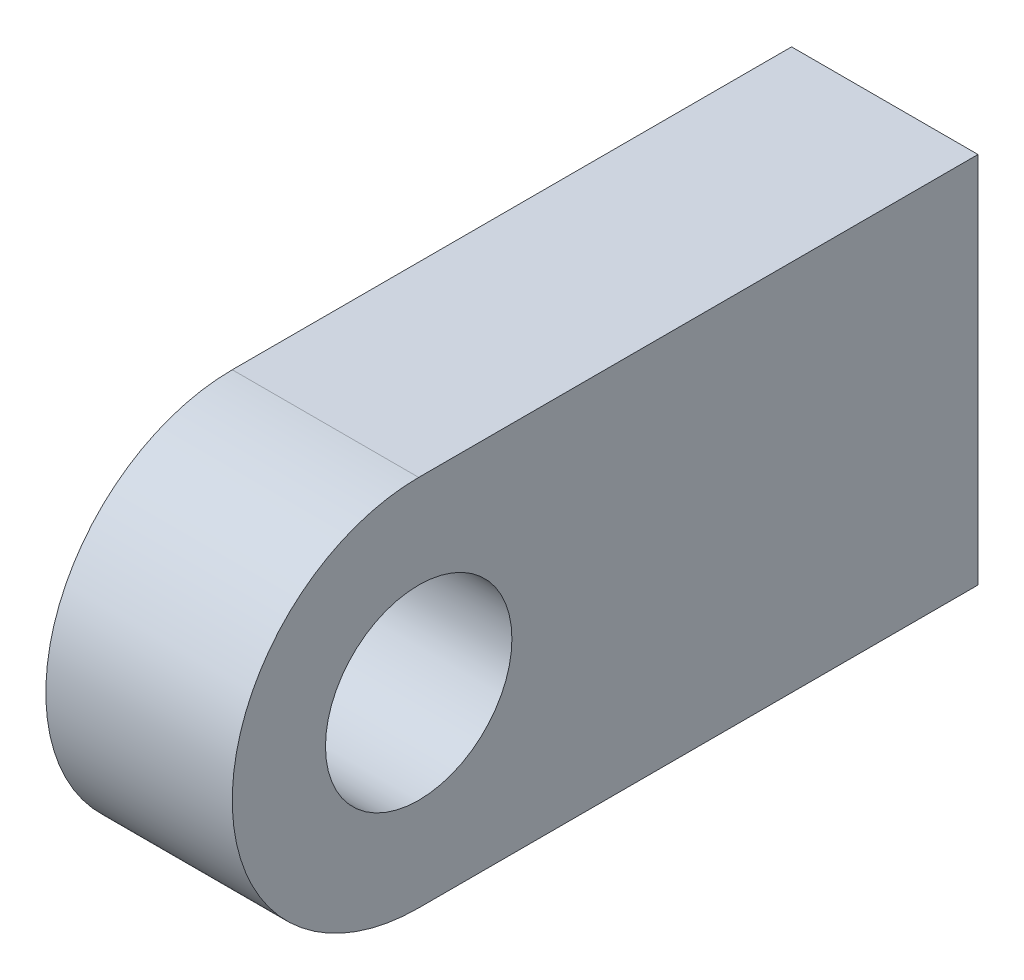
ISO-10303-21;
HEADER;
FILE_DESCRIPTION(('STEP AP214'),'2;1');
FILE_NAME('part.step','',(''),(''),'','','');
FILE_SCHEMA(('AUTOMOTIVE_DESIGN { 1 0 10303 214 1 1 1 1 }'));
ENDSEC;
DATA;
#1=APPLICATION_CONTEXT('core data for automotive mechanical design processes');
#2=APPLICATION_PROTOCOL_DEFINITION('international standard','automotive_design',2000,#1);
#3=PRODUCT_CONTEXT('',#1,'mechanical');
#4=PRODUCT('Part','Part','',(#3));
#5=PRODUCT_RELATED_PRODUCT_CATEGORY('part','',(#4));
#6=PRODUCT_DEFINITION_FORMATION('','',#4);
#7=PRODUCT_DEFINITION_CONTEXT('part definition',#1,'design');
#8=PRODUCT_DEFINITION('design','',#6,#7);
#9=PRODUCT_DEFINITION_SHAPE('','',#8);
#10=(LENGTH_UNIT() NAMED_UNIT(*) SI_UNIT(.MILLI.,.METRE.));
#11=(NAMED_UNIT(*) PLANE_ANGLE_UNIT() SI_UNIT($,.RADIAN.));
#12=(NAMED_UNIT(*) SI_UNIT($,.STERADIAN.) SOLID_ANGLE_UNIT());
#13=UNCERTAINTY_MEASURE_WITH_UNIT(LENGTH_MEASURE(1.E-05),#10,'distance_accuracy_value','');
#14=(GEOMETRIC_REPRESENTATION_CONTEXT(3) GLOBAL_UNCERTAINTY_ASSIGNED_CONTEXT((#13)) GLOBAL_UNIT_ASSIGNED_CONTEXT((#10,
#11,#12)) REPRESENTATION_CONTEXT('',''));
#15=CARTESIAN_POINT('',(0.,0.,0.));
#16=DIRECTION('',(0.,0.,1.));
#17=DIRECTION('',(1.,0.,0.));
#18=AXIS2_PLACEMENT_3D('',#15,#16,#17);
#19=CARTESIAN_POINT('',(-13.,0.,265.));
#20=DIRECTION('',(-1.,0.,0.));
#21=DIRECTION('',(0.,0.,1.));
#22=AXIS2_PLACEMENT_3D('',#19,#20,#21);
#23=PLANE('',#22);
#24=CARTESIAN_POINT('',(-13.,0.,265.));
#25=DIRECTION('',(-1.,0.,0.));
#26=DIRECTION('',(0.,0.,1.));
#27=AXIS2_PLACEMENT_3D('',#24,#25,#26);
#28=CIRCLE('',#27,9.99999999999994);
#29=CARTESIAN_POINT('',(-13.,-9.99999999999994,265.));
#30=VERTEX_POINT('',#29);
#31=CARTESIAN_POINT('',(-13.,9.99999999999994,265.));
#32=VERTEX_POINT('',#31);
#33=EDGE_CURVE('E105',#30,#32,#28,.T.);
#34=ORIENTED_EDGE('',*,*,#33,.T.);
#35=DIRECTION('',(0.,0.,-1.));
#36=VECTOR('',#35,1.);
#37=CARTESIAN_POINT('',(-13.,9.99999999999994,265.));
#38=LINE('',#37,#36);
#39=CARTESIAN_POINT('',(-13.,9.99999999999993,235.));
#40=VERTEX_POINT('',#39);
#41=EDGE_CURVE('E74',#32,#40,#38,.T.);
#42=ORIENTED_EDGE('',*,*,#41,.T.);
#43=DIRECTION('',(0.,-1.,0.));
#44=VECTOR('',#43,1.);
#45=CARTESIAN_POINT('',(-13.,9.99999999999993,235.));
#46=LINE('',#45,#44);
#47=CARTESIAN_POINT('',(-13.,-9.99999999999993,235.));
#48=VERTEX_POINT('',#47);
#49=EDGE_CURVE('E113',#40,#48,#46,.T.);
#50=ORIENTED_EDGE('',*,*,#49,.T.);
#51=DIRECTION('',(0.,0.,1.));
#52=VECTOR('',#51,1.);
#53=CARTESIAN_POINT('',(-13.,-9.99999999999993,235.));
#54=LINE('',#53,#52);
#55=EDGE_CURVE('E98',#48,#30,#54,.T.);
#56=ORIENTED_EDGE('',*,*,#55,.T.);
#57=EDGE_LOOP('',(#34,#42,#50,#56));
#58=FACE_BOUND('',#57,.T.);
#59=CARTESIAN_POINT('',(-13.,0.,265.));
#60=DIRECTION('',(-1.,0.,0.));
#61=DIRECTION('',(0.,0.,1.));
#62=AXIS2_PLACEMENT_3D('',#59,#60,#61);
#63=CIRCLE('',#62,4.99999999999999);
#64=CARTESIAN_POINT('',(-13.,0.,270.));
#65=VERTEX_POINT('',#64);
#66=EDGE_CURVE('E45',#65,#65,#63,.T.);
#67=ORIENTED_EDGE('',*,*,#66,.F.);
#68=EDGE_LOOP('',(#67));
#69=FACE_BOUND('',#68,.T.);
#70=ADVANCED_FACE('F41',(#58,#69),#23,.T.);
#71=CARTESIAN_POINT('',(-3.,0.,265.));
#72=DIRECTION('',(-1.,0.,0.));
#73=DIRECTION('',(0.,0.,1.));
#74=AXIS2_PLACEMENT_3D('',#71,#72,#73);
#75=PLANE('',#74);
#76=CARTESIAN_POINT('',(-3.,0.,265.));
#77=DIRECTION('',(-1.,0.,0.));
#78=DIRECTION('',(0.,0.,1.));
#79=AXIS2_PLACEMENT_3D('',#76,#77,#78);
#80=CIRCLE('',#79,9.99999999999994);
#81=CARTESIAN_POINT('',(-3.,-9.99999999999994,265.));
#82=VERTEX_POINT('',#81);
#83=CARTESIAN_POINT('',(-3.,9.99999999999994,265.));
#84=VERTEX_POINT('',#83);
#85=EDGE_CURVE('E104',#82,#84,#80,.T.);
#86=ORIENTED_EDGE('',*,*,#85,.F.);
#87=DIRECTION('',(0.,0.,1.));
#88=VECTOR('',#87,1.);
#89=CARTESIAN_POINT('',(-3.,-9.99999999999993,235.));
#90=LINE('',#89,#88);
#91=CARTESIAN_POINT('',(-3.,-9.99999999999993,235.));
#92=VERTEX_POINT('',#91);
#93=EDGE_CURVE('E84',#92,#82,#90,.T.);
#94=ORIENTED_EDGE('',*,*,#93,.F.);
#95=DIRECTION('',(0.,-1.,0.));
#96=VECTOR('',#95,1.);
#97=CARTESIAN_POINT('',(-3.,9.99999999999993,235.));
#98=LINE('',#97,#96);
#99=CARTESIAN_POINT('',(-3.,9.99999999999993,235.));
#100=VERTEX_POINT('',#99);
#101=EDGE_CURVE('E90',#100,#92,#98,.T.);
#102=ORIENTED_EDGE('',*,*,#101,.F.);
#103=DIRECTION('',(0.,0.,-1.));
#104=VECTOR('',#103,1.);
#105=CARTESIAN_POINT('',(-3.,9.99999999999994,265.));
#106=LINE('',#105,#104);
#107=EDGE_CURVE('E58',#84,#100,#106,.T.);
#108=ORIENTED_EDGE('',*,*,#107,.F.);
#109=EDGE_LOOP('',(#86,#94,#102,#108));
#110=FACE_BOUND('',#109,.T.);
#111=CARTESIAN_POINT('',(-3.,0.,265.));
#112=DIRECTION('',(-1.,0.,0.));
#113=DIRECTION('',(0.,0.,1.));
#114=AXIS2_PLACEMENT_3D('',#111,#112,#113);
#115=CIRCLE('',#114,4.99999999999999);
#116=CARTESIAN_POINT('',(-3.,0.,270.));
#117=VERTEX_POINT('',#116);
#118=EDGE_CURVE('E11',#117,#117,#115,.T.);
#119=ORIENTED_EDGE('',*,*,#118,.T.);
#120=EDGE_LOOP('',(#119));
#121=FACE_BOUND('',#120,.T.);
#122=ADVANCED_FACE('F101',(#110,#121),#75,.F.);
#123=CARTESIAN_POINT('',(-13.,0.,265.));
#124=DIRECTION('',(1.,0.,0.));
#125=DIRECTION('',(0.,0.,-1.));
#126=AXIS2_PLACEMENT_3D('',#123,#124,#125);
#127=CYLINDRICAL_SURFACE('',#126,9.99999999999994);
#128=ORIENTED_EDGE('',*,*,#85,.T.);
#129=DIRECTION('',(1.,0.,0.));
#130=VECTOR('',#129,1.);
#131=CARTESIAN_POINT('',(-13.,9.99999999999994,265.));
#132=LINE('',#131,#130);
#133=EDGE_CURVE('E120',#32,#84,#132,.T.);
#134=ORIENTED_EDGE('',*,*,#133,.F.);
#135=ORIENTED_EDGE('',*,*,#33,.F.);
#136=DIRECTION('',(1.,0.,0.));
#137=VECTOR('',#136,1.);
#138=CARTESIAN_POINT('',(-13.,-9.99999999999994,265.));
#139=LINE('',#138,#137);
#140=EDGE_CURVE('E99',#30,#82,#139,.T.);
#141=ORIENTED_EDGE('',*,*,#140,.T.);
#142=EDGE_LOOP('',(#128,#134,#135,#141));
#143=FACE_BOUND('',#142,.T.);
#144=ADVANCED_FACE('F119',(#143),#127,.T.);
#145=CARTESIAN_POINT('',(-13.,9.99999999999994,265.));
#146=DIRECTION('',(0.,-1.,0.));
#147=DIRECTION('',(0.,0.,-1.));
#148=AXIS2_PLACEMENT_3D('',#145,#146,#147);
#149=PLANE('',#148);
#150=ORIENTED_EDGE('',*,*,#107,.T.);
#151=DIRECTION('',(1.,0.,0.));
#152=VECTOR('',#151,1.);
#153=CARTESIAN_POINT('',(-13.,9.99999999999993,235.));
#154=LINE('',#153,#152);
#155=EDGE_CURVE('E95',#40,#100,#154,.T.);
#156=ORIENTED_EDGE('',*,*,#155,.F.);
#157=ORIENTED_EDGE('',*,*,#41,.F.);
#158=ORIENTED_EDGE('',*,*,#133,.T.);
#159=EDGE_LOOP('',(#150,#156,#157,#158));
#160=FACE_BOUND('',#159,.T.);
#161=ADVANCED_FACE('F123',(#160),#149,.F.);
#162=CARTESIAN_POINT('',(-13.,9.99999999999993,235.));
#163=DIRECTION('',(0.,0.,1.));
#164=DIRECTION('',(1.,0.,0.));
#165=AXIS2_PLACEMENT_3D('',#162,#163,#164);
#166=PLANE('',#165);
#167=ORIENTED_EDGE('',*,*,#101,.T.);
#168=DIRECTION('',(1.,0.,0.));
#169=VECTOR('',#168,1.);
#170=CARTESIAN_POINT('',(-13.,-9.99999999999993,235.));
#171=LINE('',#170,#169);
#172=EDGE_CURVE('E93',#48,#92,#171,.T.);
#173=ORIENTED_EDGE('',*,*,#172,.F.);
#174=ORIENTED_EDGE('',*,*,#49,.F.);
#175=ORIENTED_EDGE('',*,*,#155,.T.);
#176=EDGE_LOOP('',(#167,#173,#174,#175));
#177=FACE_BOUND('',#176,.T.);
#178=ADVANCED_FACE('F91',(#177),#166,.F.);
#179=CARTESIAN_POINT('',(-13.,-9.99999999999993,235.));
#180=DIRECTION('',(0.,1.,0.));
#181=DIRECTION('',(0.,0.,1.));
#182=AXIS2_PLACEMENT_3D('',#179,#180,#181);
#183=PLANE('',#182);
#184=ORIENTED_EDGE('',*,*,#93,.T.);
#185=ORIENTED_EDGE('',*,*,#140,.F.);
#186=ORIENTED_EDGE('',*,*,#55,.F.);
#187=ORIENTED_EDGE('',*,*,#172,.T.);
#188=EDGE_LOOP('',(#184,#185,#186,#187));
#189=FACE_BOUND('',#188,.T.);
#190=ADVANCED_FACE('F97',(#189),#183,.F.);
#191=CARTESIAN_POINT('',(-13.,0.,265.));
#192=DIRECTION('',(1.,0.,0.));
#193=DIRECTION('',(0.,0.,-1.));
#194=AXIS2_PLACEMENT_3D('',#191,#192,#193);
#195=CYLINDRICAL_SURFACE('',#194,4.99999999999999);
#196=ORIENTED_EDGE('',*,*,#66,.T.);
#197=EDGE_LOOP('',(#196));
#198=FACE_BOUND('',#197,.T.);
#199=ORIENTED_EDGE('',*,*,#118,.F.);
#200=EDGE_LOOP('',(#199));
#201=FACE_BOUND('',#200,.T.);
#202=ADVANCED_FACE('F43',(#198,#201),#195,.F.);
#203=CLOSED_SHELL('',(#70,#122,#144,#161,#178,#190,#202));
#204=MANIFOLD_SOLID_BREP('B2',#203);
#205=ADVANCED_BREP_SHAPE_REPRESENTATION('',(#18,#204),#14);
#206=SHAPE_DEFINITION_REPRESENTATION(#9,#205);
ENDSEC;
END-ISO-10303-21;
